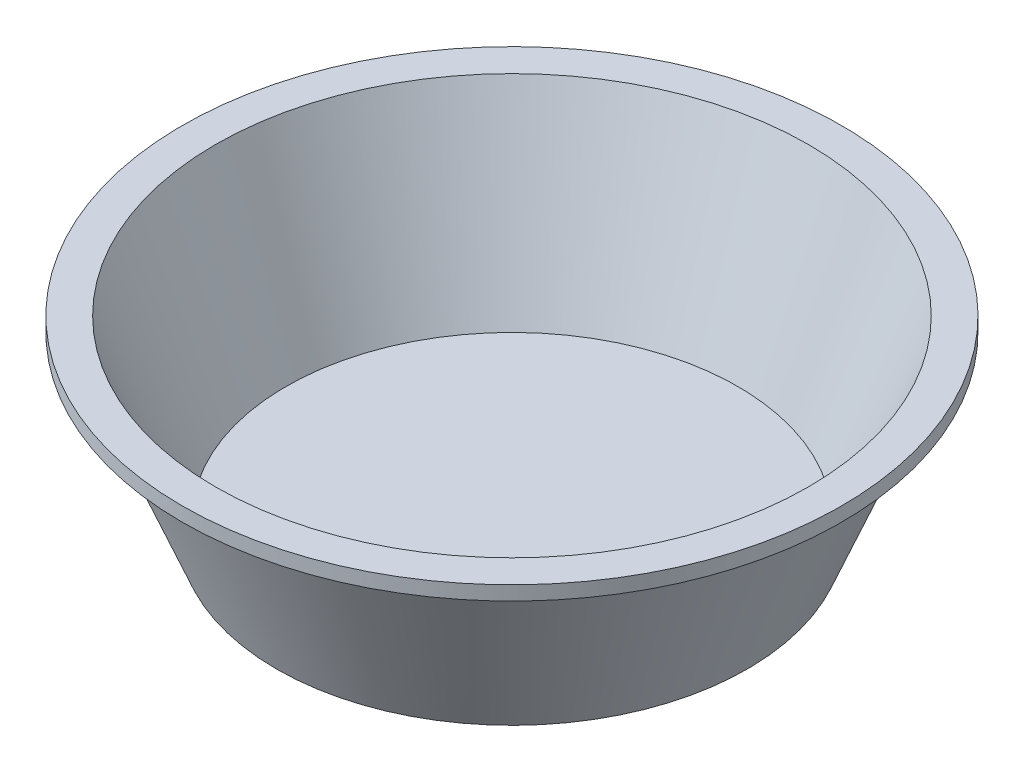
ISO-10303-21;
HEADER;
FILE_DESCRIPTION(('STEP AP214'),'2;1');
FILE_NAME('part.step','',(''),(''),'','','');
FILE_SCHEMA(('AUTOMOTIVE_DESIGN { 1 0 10303 214 1 1 1 1 }'));
ENDSEC;
DATA;
#1=APPLICATION_CONTEXT('core data for automotive mechanical design processes');
#2=APPLICATION_PROTOCOL_DEFINITION('international standard','automotive_design',2000,#1);
#3=PRODUCT_CONTEXT('',#1,'mechanical');
#4=PRODUCT('Part','Part','',(#3));
#5=PRODUCT_RELATED_PRODUCT_CATEGORY('part','',(#4));
#6=PRODUCT_DEFINITION_FORMATION('','',#4);
#7=PRODUCT_DEFINITION_CONTEXT('part definition',#1,'design');
#8=PRODUCT_DEFINITION('design','',#6,#7);
#9=PRODUCT_DEFINITION_SHAPE('','',#8);
#10=(LENGTH_UNIT() NAMED_UNIT(*) SI_UNIT(.MILLI.,.METRE.));
#11=(NAMED_UNIT(*) PLANE_ANGLE_UNIT() SI_UNIT($,.RADIAN.));
#12=(NAMED_UNIT(*) SI_UNIT($,.STERADIAN.) SOLID_ANGLE_UNIT());
#13=UNCERTAINTY_MEASURE_WITH_UNIT(LENGTH_MEASURE(1.E-05),#10,'distance_accuracy_value','');
#14=(GEOMETRIC_REPRESENTATION_CONTEXT(3) GLOBAL_UNCERTAINTY_ASSIGNED_CONTEXT((#13)) GLOBAL_UNIT_ASSIGNED_CONTEXT((#10,
#11,#12)) REPRESENTATION_CONTEXT('',''));
#15=CARTESIAN_POINT('',(0.,0.,0.));
#16=DIRECTION('',(0.,0.,1.));
#17=DIRECTION('',(1.,0.,0.));
#18=AXIS2_PLACEMENT_3D('',#15,#16,#17);
#19=CARTESIAN_POINT('',(0.,0.,0.));
#20=DIRECTION('',(0.,1.,0.));
#21=DIRECTION('',(0.,0.,1.));
#22=AXIS2_PLACEMENT_3D('',#19,#20,#21);
#23=PLANE('',#22);
#24=CARTESIAN_POINT('',(0.,0.,0.));
#25=DIRECTION('',(0.,1.,0.));
#26=DIRECTION('',(0.,0.,1.));
#27=AXIS2_PLACEMENT_3D('',#24,#25,#26);
#28=CIRCLE('',#27,50.);
#29=CARTESIAN_POINT('',(0.,0.,50.));
#30=VERTEX_POINT('',#29);
#31=EDGE_CURVE('E10',#30,#30,#28,.T.);
#32=ORIENTED_EDGE('',*,*,#31,.F.);
#33=EDGE_LOOP('',(#32));
#34=FACE_BOUND('',#33,.T.);
#35=ADVANCED_FACE('F31',(#34),#23,.F.);
#36=CARTESIAN_POINT('',(0.,0.,0.));
#37=DIRECTION('',(0.,1.,0.));
#38=DIRECTION('',(0.,0.,1.));
#39=AXIS2_PLACEMENT_3D('',#36,#37,#38);
#40=CONICAL_SURFACE('',#39,50.,0.385157506363474);
#41=CARTESIAN_POINT('',(0.,37.,0.));
#42=DIRECTION('',(0.,1.,0.));
#43=DIRECTION('',(0.,0.,1.));
#44=AXIS2_PLACEMENT_3D('',#41,#42,#43);
#45=CIRCLE('',#44,65.);
#46=CARTESIAN_POINT('',(0.,37.,65.));
#47=VERTEX_POINT('',#46);
#48=EDGE_CURVE('E37',#47,#47,#45,.T.);
#49=ORIENTED_EDGE('',*,*,#48,.F.);
#50=EDGE_LOOP('',(#49));
#51=FACE_BOUND('',#50,.T.);
#52=ORIENTED_EDGE('',*,*,#31,.T.);
#53=EDGE_LOOP('',(#52));
#54=FACE_BOUND('',#53,.T.);
#55=ADVANCED_FACE('F79',(#51,#54),#40,.T.);
#56=CARTESIAN_POINT('',(65.,37.,0.));
#57=DIRECTION('',(0.,1.,0.));
#58=DIRECTION('',(0.,0.,1.));
#59=AXIS2_PLACEMENT_3D('',#56,#57,#58);
#60=PLANE('',#59);
#61=CARTESIAN_POINT('',(0.,37.,0.));
#62=DIRECTION('',(0.,1.,0.));
#63=DIRECTION('',(0.,0.,1.));
#64=AXIS2_PLACEMENT_3D('',#61,#62,#63);
#65=CIRCLE('',#64,70.);
#66=CARTESIAN_POINT('',(0.,37.,70.));
#67=VERTEX_POINT('',#66);
#68=EDGE_CURVE('E41',#67,#67,#65,.T.);
#69=ORIENTED_EDGE('',*,*,#68,.F.);
#70=EDGE_LOOP('',(#69));
#71=FACE_BOUND('',#70,.T.);
#72=ORIENTED_EDGE('',*,*,#48,.T.);
#73=EDGE_LOOP('',(#72));
#74=FACE_BOUND('',#73,.T.);
#75=ADVANCED_FACE('F74',(#71,#74),#60,.F.);
#76=CARTESIAN_POINT('',(0.,2.99999999999999,0.));
#77=DIRECTION('',(0.,1.,0.));
#78=DIRECTION('',(0.,0.,1.));
#79=AXIS2_PLACEMENT_3D('',#76,#77,#78);
#80=CYLINDRICAL_SURFACE('',#79,70.);
#81=CARTESIAN_POINT('',(0.,40.,0.));
#82=DIRECTION('',(0.,1.,0.));
#83=DIRECTION('',(0.,0.,1.));
#84=AXIS2_PLACEMENT_3D('',#81,#82,#83);
#85=CIRCLE('',#84,70.);
#86=CARTESIAN_POINT('',(0.,40.,70.));
#87=VERTEX_POINT('',#86);
#88=EDGE_CURVE('E45',#87,#87,#85,.T.);
#89=ORIENTED_EDGE('',*,*,#88,.F.);
#90=EDGE_LOOP('',(#89));
#91=FACE_BOUND('',#90,.T.);
#92=ORIENTED_EDGE('',*,*,#68,.T.);
#93=EDGE_LOOP('',(#92));
#94=FACE_BOUND('',#93,.T.);
#95=ADVANCED_FACE('F68',(#91,#94),#80,.T.);
#96=CARTESIAN_POINT('',(70.,40.,0.));
#97=DIRECTION('',(0.,-1.,0.));
#98=DIRECTION('',(0.,0.,-1.));
#99=AXIS2_PLACEMENT_3D('',#96,#97,#98);
#100=PLANE('',#99);
#101=CARTESIAN_POINT('',(0.,40.,0.));
#102=DIRECTION('',(0.,1.,0.));
#103=DIRECTION('',(0.,0.,1.));
#104=AXIS2_PLACEMENT_3D('',#101,#102,#103);
#105=CIRCLE('',#104,62.9790597657821);
#106=CARTESIAN_POINT('',(0.,40.,62.9790597657821));
#107=VERTEX_POINT('',#106);
#108=EDGE_CURVE('E50',#107,#107,#105,.T.);
#109=ORIENTED_EDGE('',*,*,#108,.F.);
#110=EDGE_LOOP('',(#109));
#111=FACE_BOUND('',#110,.T.);
#112=ORIENTED_EDGE('',*,*,#88,.T.);
#113=EDGE_LOOP('',(#112));
#114=FACE_BOUND('',#113,.T.);
#115=ADVANCED_FACE('F62',(#111,#114),#100,.F.);
#116=CARTESIAN_POINT('',(0.,40.,0.));
#117=DIRECTION('',(0.,1.,0.));
#118=DIRECTION('',(0.,0.,1.));
#119=AXIS2_PLACEMENT_3D('',#116,#117,#118);
#120=CONICAL_SURFACE('',#119,62.9790597657821,0.385157506363474);
#121=CARTESIAN_POINT('',(0.,3.,0.));
#122=DIRECTION('',(0.,1.,0.));
#123=DIRECTION('',(0.,0.,1.));
#124=AXIS2_PLACEMENT_3D('',#121,#122,#123);
#125=CIRCLE('',#124,47.9790597657821);
#126=CARTESIAN_POINT('',(0.,3.,47.9790597657821));
#127=VERTEX_POINT('',#126);
#128=EDGE_CURVE('E53',#127,#127,#125,.T.);
#129=ORIENTED_EDGE('',*,*,#128,.F.);
#130=EDGE_LOOP('',(#129));
#131=FACE_BOUND('',#130,.T.);
#132=ORIENTED_EDGE('',*,*,#108,.T.);
#133=EDGE_LOOP('',(#132));
#134=FACE_BOUND('',#133,.T.);
#135=ADVANCED_FACE('F59',(#131,#134),#120,.F.);
#136=CARTESIAN_POINT('',(47.9790597657821,3.,0.));
#137=DIRECTION('',(0.,-1.,0.));
#138=DIRECTION('',(0.,0.,-1.));
#139=AXIS2_PLACEMENT_3D('',#136,#137,#138);
#140=PLANE('',#139);
#141=ORIENTED_EDGE('',*,*,#128,.T.);
#142=EDGE_LOOP('',(#141));
#143=FACE_BOUND('',#142,.T.);
#144=ADVANCED_FACE('F57',(#143),#140,.F.);
#145=CLOSED_SHELL('',(#35,#55,#75,#95,#115,#135,#144));
#146=MANIFOLD_SOLID_BREP('B2',#145);
#147=ADVANCED_BREP_SHAPE_REPRESENTATION('',(#18,#146),#14);
#148=SHAPE_DEFINITION_REPRESENTATION(#9,#147);
ENDSEC;
END-ISO-10303-21;
